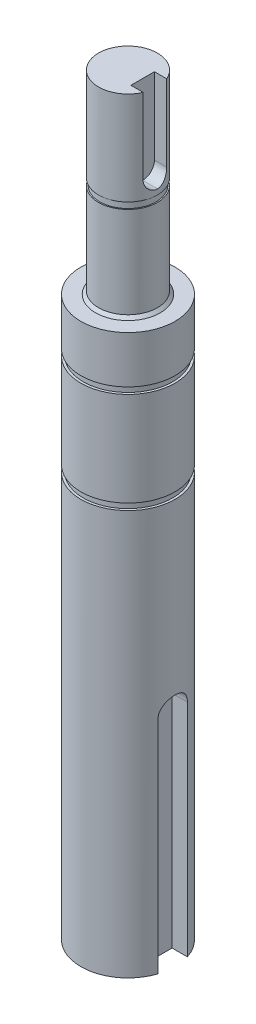
ISO-10303-21;
HEADER;
FILE_DESCRIPTION(('STEP AP214'),'2;1');
FILE_NAME('part.step','',(''),(''),'','','');
FILE_SCHEMA(('AUTOMOTIVE_DESIGN { 1 0 10303 214 1 1 1 1 }'));
ENDSEC;
DATA;
#1=APPLICATION_CONTEXT('core data for automotive mechanical design processes');
#2=APPLICATION_PROTOCOL_DEFINITION('international standard','automotive_design',2000,#1);
#3=PRODUCT_CONTEXT('',#1,'mechanical');
#4=PRODUCT('Part','Part','',(#3));
#5=PRODUCT_RELATED_PRODUCT_CATEGORY('part','',(#4));
#6=PRODUCT_DEFINITION_FORMATION('','',#4);
#7=PRODUCT_DEFINITION_CONTEXT('part definition',#1,'design');
#8=PRODUCT_DEFINITION('design','',#6,#7);
#9=PRODUCT_DEFINITION_SHAPE('','',#8);
#10=(LENGTH_UNIT() NAMED_UNIT(*) SI_UNIT(.MILLI.,.METRE.));
#11=(NAMED_UNIT(*) PLANE_ANGLE_UNIT() SI_UNIT($,.RADIAN.));
#12=(NAMED_UNIT(*) SI_UNIT($,.STERADIAN.) SOLID_ANGLE_UNIT());
#13=UNCERTAINTY_MEASURE_WITH_UNIT(LENGTH_MEASURE(1.E-05),#10,'distance_accuracy_value','');
#14=(GEOMETRIC_REPRESENTATION_CONTEXT(3) GLOBAL_UNCERTAINTY_ASSIGNED_CONTEXT((#13)) GLOBAL_UNIT_ASSIGNED_CONTEXT((#10,
#11,#12)) REPRESENTATION_CONTEXT('',''));
#15=CARTESIAN_POINT('',(0.,0.,0.));
#16=DIRECTION('',(0.,0.,1.));
#17=DIRECTION('',(1.,0.,0.));
#18=AXIS2_PLACEMENT_3D('',#15,#16,#17);
#19=CARTESIAN_POINT('',(0.,-95.,0.));
#20=DIRECTION('',(0.,-1.,0.));
#21=DIRECTION('',(0.,0.,-1.));
#22=AXIS2_PLACEMENT_3D('',#19,#20,#21);
#23=PLANE('',#22);
#24=CARTESIAN_POINT('',(0.,-95.,0.));
#25=DIRECTION('',(0.,-1.,0.));
#26=DIRECTION('',(0.,0.,-1.));
#27=AXIS2_PLACEMENT_3D('',#24,#25,#26);
#28=CIRCLE('',#27,2.1);
#29=CARTESIAN_POINT('',(0.,-95.,-2.1));
#30=VERTEX_POINT('',#29);
#31=EDGE_CURVE('E362',#30,#30,#28,.T.);
#32=ORIENTED_EDGE('',*,*,#31,.F.);
#33=EDGE_LOOP('',(#32));
#34=FACE_BOUND('',#33,.T.);
#35=CARTESIAN_POINT('',(0.,-95.,0.));
#36=DIRECTION('',(0.,-1.,0.));
#37=DIRECTION('',(0.,0.,-1.));
#38=AXIS2_PLACEMENT_3D('',#35,#36,#37);
#39=CIRCLE('',#38,8.);
#40=CARTESIAN_POINT('',(7.59934207678533,-95.,2.5));
#41=VERTEX_POINT('',#40);
#42=CARTESIAN_POINT('',(7.59934207678533,-95.,-2.5));
#43=VERTEX_POINT('',#42);
#44=EDGE_CURVE('E141',#41,#43,#39,.T.);
#45=ORIENTED_EDGE('',*,*,#44,.T.);
#46=DIRECTION('',(1.,0.,0.));
#47=VECTOR('',#46,1.);
#48=CARTESIAN_POINT('',(5.,-95.,-2.5));
#49=LINE('',#48,#47);
#50=CARTESIAN_POINT('',(5.,-95.,-2.5));
#51=VERTEX_POINT('',#50);
#52=EDGE_CURVE('E324',#51,#43,#49,.T.);
#53=ORIENTED_EDGE('',*,*,#52,.F.);
#54=DIRECTION('',(0.,0.,-1.));
#55=VECTOR('',#54,1.);
#56=CARTESIAN_POINT('',(5.,-95.,2.5));
#57=LINE('',#56,#55);
#58=CARTESIAN_POINT('',(5.,-95.,2.5));
#59=VERTEX_POINT('',#58);
#60=EDGE_CURVE('E347',#59,#51,#57,.T.);
#61=ORIENTED_EDGE('',*,*,#60,.F.);
#62=DIRECTION('',(-1.,0.,0.));
#63=VECTOR('',#62,1.);
#64=CARTESIAN_POINT('',(7.59934207678533,-95.,2.5));
#65=LINE('',#64,#63);
#66=EDGE_CURVE('E343',#41,#59,#65,.T.);
#67=ORIENTED_EDGE('',*,*,#66,.F.);
#68=EDGE_LOOP('',(#45,#53,#61,#67));
#69=FACE_BOUND('',#68,.T.);
#70=ADVANCED_FACE('F38',(#34,#69),#23,.T.);
#71=CARTESIAN_POINT('',(0.,-95.,0.));
#72=DIRECTION('',(0.,1.,0.));
#73=DIRECTION('',(0.,0.,1.));
#74=AXIS2_PLACEMENT_3D('',#71,#72,#73);
#75=CYLINDRICAL_SURFACE('',#74,8.);
#76=CARTESIAN_POINT('',(0.,-26.2,0.));
#77=DIRECTION('',(0.,1.,0.));
#78=DIRECTION('',(0.,0.,1.));
#79=AXIS2_PLACEMENT_3D('',#76,#77,#78);
#80=CIRCLE('',#79,8.);
#81=CARTESIAN_POINT('',(0.,-26.2,8.));
#82=VERTEX_POINT('',#81);
#83=EDGE_CURVE('E161',#82,#82,#80,.T.);
#84=ORIENTED_EDGE('',*,*,#83,.F.);
#85=EDGE_LOOP('',(#84));
#86=FACE_BOUND('',#85,.T.);
#87=DIRECTION('',(0.,1.,0.));
#88=VECTOR('',#87,1.);
#89=CARTESIAN_POINT('',(7.59934207678533,-376.230768092719,-2.5));
#90=LINE('',#89,#88);
#91=CARTESIAN_POINT('',(7.59934207678533,-57.5,-2.5));
#92=VERTEX_POINT('',#91);
#93=EDGE_CURVE('E320',#43,#92,#90,.T.);
#94=ORIENTED_EDGE('',*,*,#93,.F.);
#95=ORIENTED_EDGE('',*,*,#44,.F.);
#96=DIRECTION('',(0.,1.,0.));
#97=VECTOR('',#96,1.);
#98=CARTESIAN_POINT('',(7.59934207678533,-376.230768092719,2.5));
#99=LINE('',#98,#97);
#100=CARTESIAN_POINT('',(7.59934207678533,-57.5,2.5));
#101=VERTEX_POINT('',#100);
#102=EDGE_CURVE('E353',#41,#101,#99,.T.);
#103=ORIENTED_EDGE('',*,*,#102,.T.);
#104=CARTESIAN_POINT('',(7.59934207678533,-57.5,2.5));
#105=CARTESIAN_POINT('',(7.59933203059267,-57.431531563478,2.50000872196325));
#106=CARTESIAN_POINT('',(7.60026717306941,-57.3630688262051,2.49718741918658));
#107=CARTESIAN_POINT('',(7.60395313145729,-57.2266689831246,2.48595264914487));
#108=CARTESIAN_POINT('',(7.60670350954134,-57.1587317545633,2.47754053035741));
#109=CARTESIAN_POINT('',(7.61393533486615,-57.024049291047,2.45522271247334));
#110=CARTESIAN_POINT('',(7.61841199615304,-56.9573012896764,2.44133219929441));
#111=CARTESIAN_POINT('',(7.62895090994293,-56.8252934420751,2.40819606778692));
#112=CARTESIAN_POINT('',(7.63501320947711,-56.7600336400481,2.38895029061629));
#113=CARTESIAN_POINT('',(7.65531347588401,-56.5672144256323,2.32342257733534));
#114=CARTESIAN_POINT('',(7.6716751548635,-56.442436228289,2.26932026330938));
#115=CARTESIAN_POINT('',(7.70820123348356,-56.2037163263157,2.1419609847559));
#116=CARTESIAN_POINT('',(7.72836773665081,-56.089780668738,2.06869341586784));
#117=CARTESIAN_POINT('',(7.77100171280289,-55.872051458723,1.90239618040339));
#118=CARTESIAN_POINT('',(7.79352105652789,-55.768680507325,1.80882544662834));
#119=CARTESIAN_POINT('',(7.83788376428168,-55.578811225447,1.60572918907888));
#120=CARTESIAN_POINT('',(7.85972699416612,-55.4923162254135,1.49620052346257));
#121=CARTESIAN_POINT('',(7.90087771567734,-55.3367529003338,1.2612159659295));
#122=CARTESIAN_POINT('',(7.9201155937937,-55.2681295511064,1.13545249996471));
#123=CARTESIAN_POINT('',(7.95326113327994,-55.153214675019,0.873505280661303));
#124=CARTESIAN_POINT('',(7.96717355482022,-55.1069031950257,0.737330964343791));
#125=CARTESIAN_POINT('',(7.98493255267701,-55.0485350656773,0.500432439140228));
#126=CARTESIAN_POINT('',(7.99054579169218,-55.0303736604662,0.401302860064734));
#127=CARTESIAN_POINT('',(7.99809598427656,-55.0060927316699,0.201469160042704));
#128=CARTESIAN_POINT('',(8.00003381815027,-54.9999703245845,0.100765421953975));
#129=CARTESIAN_POINT('',(8.,-55.,0.));
#130=B_SPLINE_CURVE_WITH_KNOTS('',3,(#104,#105,#106,#107,#108,#109,#110,#111,#112,#113,#114,
#115,#116,#117,#118,#119,#120,#121,#122,#123,#124,#125,#126,#127,#128,#129),.UNSPECIFIED.,.F.,
.F.,(4,2,2,2,2,2,2,2,2,2,2,2,4),(0.,0.205331144838566,0.410612782770134,0.615329342028563,
0.820051974016308,1.22895878902158,1.63809233732391,2.05987818424721,2.48174718603714,
2.91328775873344,3.34444169220914,3.64649245014737,3.9484708540928),.UNSPECIFIED.);
#131=CARTESIAN_POINT('',(8.,-55.,0.));
#132=VERTEX_POINT('',#131);
#133=EDGE_CURVE('E53',#101,#132,#130,.T.);
#134=ORIENTED_EDGE('',*,*,#133,.T.);
#135=CARTESIAN_POINT('',(8.,-55.,0.));
#136=CARTESIAN_POINT('',(8.00000828681473,-54.9999914719353,-0.0685510812857066));
#137=CARTESIAN_POINT('',(7.99911908384291,-55.0028193935781,-0.137096932347897));
#138=CARTESIAN_POINT('',(7.99560730845536,-55.0140819364758,-0.273667781807106));
#139=CARTESIAN_POINT('',(7.99298509992923,-55.0225153807075,-0.341692886515693));
#140=CARTESIAN_POINT('',(7.98607774492626,-55.0448940849037,-0.47656786057859));
#141=CARTESIAN_POINT('',(7.98179688080588,-55.0588251526738,-0.543420296695729));
#142=CARTESIAN_POINT('',(7.97169475767791,-55.0920619945523,-0.675638578563826));
#143=CARTESIAN_POINT('',(7.96587346483636,-55.1113678867138,-0.74100439162836));
#144=CARTESIAN_POINT('',(7.94632126100608,-55.1771134947712,-0.934157547532818));
#145=CARTESIAN_POINT('',(7.93049329476608,-55.2314079769332,-1.05916058434143));
#146=CARTESIAN_POINT('',(7.8948846514132,-55.3592171103471,-1.29825599242918));
#147=CARTESIAN_POINT('',(7.87510214473647,-55.4327406627801,-1.41234327728855));
#148=CARTESIAN_POINT('',(7.83300545963648,-55.5993066189066,-1.62991978046949));
#149=CARTESIAN_POINT('',(7.81063643603881,-55.6928321712304,-1.73302910878894));
#150=CARTESIAN_POINT('',(7.76620277923699,-55.8957282674203,-1.92238880488912));
#151=CARTESIAN_POINT('',(7.74413823142255,-56.0051031611218,-2.00863452915542));
#152=CARTESIAN_POINT('',(7.70221548358862,-56.2399285656202,-2.16391406909981));
#153=CARTESIAN_POINT('',(7.6824263651065,-56.3657130318976,-2.23246282184784));
#154=CARTESIAN_POINT('',(7.64814458850236,-56.6276963572921,-2.34723085680233));
#155=CARTESIAN_POINT('',(7.63364673208388,-56.7638848352136,-2.39347206906809));
#156=CARTESIAN_POINT('',(7.61511563183546,-57.0005957885824,-2.45166474109376));
#157=CARTESIAN_POINT('',(7.60924580759559,-57.0995081788591,-2.46974885377124));
#158=CARTESIAN_POINT('',(7.60133872885989,-57.2989256046477,-2.49393103929294));
#159=CARTESIAN_POINT('',(7.59930112965725,-57.3994304960948,-2.50003019018091));
#160=CARTESIAN_POINT('',(7.59934207678533,-57.5,-2.5));
#161=B_SPLINE_CURVE_WITH_KNOTS('',3,(#135,#136,#137,#138,#139,#140,#141,#142,#143,#144,#145,
#146,#147,#148,#149,#150,#151,#152,#153,#154,#155,#156,#157,#158,#159,#160),.UNSPECIFIED.,.F.,
.F.,(4,2,2,2,2,2,2,2,2,2,2,2,4),(0.,0.205580238093103,0.411117322977397,0.616127245880894,
0.821141671994198,1.23068931459296,1.64042687432448,2.0614847377048,2.48265837961757,
2.91437821992857,3.34567277654391,3.64708494372789,3.94846999773575),.UNSPECIFIED.);
#162=EDGE_CURVE('E57',#132,#92,#161,.T.);
#163=ORIENTED_EDGE('',*,*,#162,.T.);
#164=EDGE_LOOP('',(#94,#95,#103,#134,#163));
#165=FACE_BOUND('',#164,.T.);
#166=ADVANCED_FACE('F233',(#86,#165),#75,.T.);
#167=CARTESIAN_POINT('',(0.,33.,0.));
#168=DIRECTION('',(0.,-1.,0.));
#169=DIRECTION('',(0.,0.,-1.));
#170=AXIS2_PLACEMENT_3D('',#167,#168,#169);
#171=CYLINDRICAL_SURFACE('',#170,5.);
#172=CARTESIAN_POINT('',(0.,0.500000000000035,0.));
#173=DIRECTION('',(0.,-1.,0.));
#174=DIRECTION('',(0.,0.,-1.));
#175=AXIS2_PLACEMENT_3D('',#172,#173,#174);
#176=CIRCLE('',#175,5.);
#177=CARTESIAN_POINT('',(0.,0.500000000000035,-5.));
#178=VERTEX_POINT('',#177);
#179=EDGE_CURVE('E46',#178,#178,#176,.F.);
#180=ORIENTED_EDGE('',*,*,#179,.T.);
#181=EDGE_LOOP('',(#180));
#182=FACE_BOUND('',#181,.T.);
#183=CARTESIAN_POINT('',(0.,16.,0.));
#184=DIRECTION('',(0.,1.,0.));
#185=DIRECTION('',(0.,0.,1.));
#186=AXIS2_PLACEMENT_3D('',#183,#184,#185);
#187=CIRCLE('',#186,5.);
#188=CARTESIAN_POINT('',(0.,16.,5.));
#189=VERTEX_POINT('',#188);
#190=EDGE_CURVE('E166',#189,#189,#187,.T.);
#191=ORIENTED_EDGE('',*,*,#190,.F.);
#192=EDGE_LOOP('',(#191));
#193=FACE_BOUND('',#192,.T.);
#194=ADVANCED_FACE('F231',(#182,#193),#171,.T.);
#195=CARTESIAN_POINT('',(0.,-8.00000000000001,0.));
#196=DIRECTION('',(0.,1.,0.));
#197=DIRECTION('',(0.,0.,1.));
#198=AXIS2_PLACEMENT_3D('',#195,#196,#197);
#199=CIRCLE('',#198,8.);
#200=CARTESIAN_POINT('',(0.,-8.00000000000001,8.));
#201=VERTEX_POINT('',#200);
#202=EDGE_CURVE('E151',#201,#201,#199,.T.);
#203=ORIENTED_EDGE('',*,*,#202,.T.);
#204=EDGE_LOOP('',(#203));
#205=FACE_BOUND('',#204,.T.);
#206=CARTESIAN_POINT('',(0.,0.,0.));
#207=DIRECTION('',(0.,-1.,0.));
#208=DIRECTION('',(0.,0.,-1.));
#209=AXIS2_PLACEMENT_3D('',#206,#207,#208);
#210=CIRCLE('',#209,8.);
#211=CARTESIAN_POINT('',(0.,0.,-8.));
#212=VERTEX_POINT('',#211);
#213=EDGE_CURVE('E147',#212,#212,#210,.T.);
#214=ORIENTED_EDGE('',*,*,#213,.T.);
#215=EDGE_LOOP('',(#214));
#216=FACE_BOUND('',#215,.T.);
#217=ADVANCED_FACE('F226',(#205,#216),#75,.T.);
#218=CARTESIAN_POINT('',(0.,0.,0.));
#219=DIRECTION('',(0.,-1.,0.));
#220=DIRECTION('',(0.,0.,-1.));
#221=AXIS2_PLACEMENT_3D('',#218,#219,#220);
#222=PLANE('',#221);
#223=CARTESIAN_POINT('',(0.,0.,0.));
#224=DIRECTION('',(0.,-1.,0.));
#225=DIRECTION('',(0.,0.,-1.));
#226=AXIS2_PLACEMENT_3D('',#223,#224,#225);
#227=CIRCLE('',#226,5.50000000000003);
#228=CARTESIAN_POINT('',(0.,0.,-5.50000000000003));
#229=VERTEX_POINT('',#228);
#230=EDGE_CURVE('E12',#229,#229,#227,.T.);
#231=ORIENTED_EDGE('',*,*,#230,.T.);
#232=EDGE_LOOP('',(#231));
#233=FACE_BOUND('',#232,.T.);
#234=ORIENTED_EDGE('',*,*,#213,.F.);
#235=EDGE_LOOP('',(#234));
#236=FACE_BOUND('',#235,.T.);
#237=ADVANCED_FACE('F230',(#233,#236),#222,.F.);
#238=CARTESIAN_POINT('',(0.,-9.1,0.));
#239=DIRECTION('',(0.,1.,0.));
#240=DIRECTION('',(0.,0.,1.));
#241=AXIS2_PLACEMENT_3D('',#238,#239,#240);
#242=PLANE('',#241);
#243=CARTESIAN_POINT('',(0.,-9.1,0.));
#244=DIRECTION('',(0.,1.,0.));
#245=DIRECTION('',(0.,0.,1.));
#246=AXIS2_PLACEMENT_3D('',#243,#244,#245);
#247=CIRCLE('',#246,7.6);
#248=CARTESIAN_POINT('',(0.,-9.1,7.6));
#249=VERTEX_POINT('',#248);
#250=EDGE_CURVE('E155',#249,#249,#247,.T.);
#251=ORIENTED_EDGE('',*,*,#250,.F.);
#252=EDGE_LOOP('',(#251));
#253=FACE_BOUND('',#252,.T.);
#254=CARTESIAN_POINT('',(0.,-9.1,0.));
#255=DIRECTION('',(0.,1.,0.));
#256=DIRECTION('',(0.,0.,1.));
#257=AXIS2_PLACEMENT_3D('',#254,#255,#256);
#258=CIRCLE('',#257,8.);
#259=CARTESIAN_POINT('',(0.,-9.1,8.));
#260=VERTEX_POINT('',#259);
#261=EDGE_CURVE('E154',#260,#260,#258,.T.);
#262=ORIENTED_EDGE('',*,*,#261,.T.);
#263=EDGE_LOOP('',(#262));
#264=FACE_BOUND('',#263,.T.);
#265=ADVANCED_FACE('F263',(#253,#264),#242,.T.);
#266=CARTESIAN_POINT('',(0.,-8.,0.));
#267=DIRECTION('',(0.,1.,0.));
#268=DIRECTION('',(0.,0.,1.));
#269=AXIS2_PLACEMENT_3D('',#266,#267,#268);
#270=PLANE('',#269);
#271=CARTESIAN_POINT('',(0.,-8.,0.));
#272=DIRECTION('',(0.,1.,0.));
#273=DIRECTION('',(0.,0.,1.));
#274=AXIS2_PLACEMENT_3D('',#271,#272,#273);
#275=CIRCLE('',#274,7.6);
#276=CARTESIAN_POINT('',(0.,-8.,7.6));
#277=VERTEX_POINT('',#276);
#278=EDGE_CURVE('E165',#277,#277,#275,.T.);
#279=ORIENTED_EDGE('',*,*,#278,.T.);
#280=EDGE_LOOP('',(#279));
#281=FACE_BOUND('',#280,.T.);
#282=ORIENTED_EDGE('',*,*,#202,.F.);
#283=EDGE_LOOP('',(#282));
#284=FACE_BOUND('',#283,.T.);
#285=ADVANCED_FACE('F259',(#281,#284),#270,.F.);
#286=CARTESIAN_POINT('',(0.,-9.1,0.));
#287=DIRECTION('',(0.,1.,0.));
#288=DIRECTION('',(0.,0.,1.));
#289=AXIS2_PLACEMENT_3D('',#286,#287,#288);
#290=CYLINDRICAL_SURFACE('',#289,7.6);
#291=ORIENTED_EDGE('',*,*,#250,.T.);
#292=EDGE_LOOP('',(#291));
#293=FACE_BOUND('',#292,.T.);
#294=ORIENTED_EDGE('',*,*,#278,.F.);
#295=EDGE_LOOP('',(#294));
#296=FACE_BOUND('',#295,.T.);
#297=ADVANCED_FACE('F262',(#293,#296),#290,.T.);
#298=CARTESIAN_POINT('',(0.,-25.1,0.));
#299=DIRECTION('',(0.,1.,0.));
#300=DIRECTION('',(0.,0.,1.));
#301=AXIS2_PLACEMENT_3D('',#298,#299,#300);
#302=CIRCLE('',#301,8.);
#303=CARTESIAN_POINT('',(0.,-25.1,8.));
#304=VERTEX_POINT('',#303);
#305=EDGE_CURVE('E158',#304,#304,#302,.T.);
#306=ORIENTED_EDGE('',*,*,#305,.T.);
#307=EDGE_LOOP('',(#306));
#308=FACE_BOUND('',#307,.T.);
#309=ORIENTED_EDGE('',*,*,#261,.F.);
#310=EDGE_LOOP('',(#309));
#311=FACE_BOUND('',#310,.T.);
#312=ADVANCED_FACE('F234',(#308,#311),#75,.T.);
#313=CARTESIAN_POINT('',(0.,-26.2,0.));
#314=DIRECTION('',(0.,1.,0.));
#315=DIRECTION('',(0.,0.,1.));
#316=AXIS2_PLACEMENT_3D('',#313,#314,#315);
#317=PLANE('',#316);
#318=CARTESIAN_POINT('',(0.,-26.2,0.));
#319=DIRECTION('',(0.,1.,0.));
#320=DIRECTION('',(0.,0.,1.));
#321=AXIS2_PLACEMENT_3D('',#318,#319,#320);
#322=CIRCLE('',#321,7.6);
#323=CARTESIAN_POINT('',(0.,-26.2,7.6));
#324=VERTEX_POINT('',#323);
#325=EDGE_CURVE('E162',#324,#324,#322,.T.);
#326=ORIENTED_EDGE('',*,*,#325,.F.);
#327=EDGE_LOOP('',(#326));
#328=FACE_BOUND('',#327,.T.);
#329=ORIENTED_EDGE('',*,*,#83,.T.);
#330=EDGE_LOOP('',(#329));
#331=FACE_BOUND('',#330,.T.);
#332=ADVANCED_FACE('F275',(#328,#331),#317,.T.);
#333=CARTESIAN_POINT('',(0.,-25.1,0.));
#334=DIRECTION('',(0.,1.,0.));
#335=DIRECTION('',(0.,0.,1.));
#336=AXIS2_PLACEMENT_3D('',#333,#334,#335);
#337=PLANE('',#336);
#338=CARTESIAN_POINT('',(0.,-25.1,0.));
#339=DIRECTION('',(0.,1.,0.));
#340=DIRECTION('',(0.,0.,1.));
#341=AXIS2_PLACEMENT_3D('',#338,#339,#340);
#342=CIRCLE('',#341,7.6);
#343=CARTESIAN_POINT('',(0.,-25.1,7.6));
#344=VERTEX_POINT('',#343);
#345=EDGE_CURVE('E172',#344,#344,#342,.T.);
#346=ORIENTED_EDGE('',*,*,#345,.T.);
#347=EDGE_LOOP('',(#346));
#348=FACE_BOUND('',#347,.T.);
#349=ORIENTED_EDGE('',*,*,#305,.F.);
#350=EDGE_LOOP('',(#349));
#351=FACE_BOUND('',#350,.T.);
#352=ADVANCED_FACE('F271',(#348,#351),#337,.F.);
#353=CARTESIAN_POINT('',(0.,-26.2,0.));
#354=DIRECTION('',(0.,1.,0.));
#355=DIRECTION('',(0.,0.,1.));
#356=AXIS2_PLACEMENT_3D('',#353,#354,#355);
#357=CYLINDRICAL_SURFACE('',#356,7.6);
#358=ORIENTED_EDGE('',*,*,#325,.T.);
#359=EDGE_LOOP('',(#358));
#360=FACE_BOUND('',#359,.T.);
#361=ORIENTED_EDGE('',*,*,#345,.F.);
#362=EDGE_LOOP('',(#361));
#363=FACE_BOUND('',#362,.T.);
#364=ADVANCED_FACE('F274',(#360,#363),#357,.T.);
#365=CARTESIAN_POINT('',(0.,17.1,0.));
#366=DIRECTION('',(0.,1.,0.));
#367=DIRECTION('',(0.,0.,1.));
#368=AXIS2_PLACEMENT_3D('',#365,#366,#367);
#369=PLANE('',#368);
#370=CARTESIAN_POINT('',(0.,17.1,0.));
#371=DIRECTION('',(0.,1.,0.));
#372=DIRECTION('',(0.,0.,1.));
#373=AXIS2_PLACEMENT_3D('',#370,#371,#372);
#374=CIRCLE('',#373,4.8);
#375=CARTESIAN_POINT('',(0.,17.1,4.8));
#376=VERTEX_POINT('',#375);
#377=EDGE_CURVE('E170',#376,#376,#374,.T.);
#378=ORIENTED_EDGE('',*,*,#377,.T.);
#379=EDGE_LOOP('',(#378));
#380=FACE_BOUND('',#379,.T.);
#381=CARTESIAN_POINT('',(0.,17.1,0.));
#382=DIRECTION('',(0.,1.,0.));
#383=DIRECTION('',(0.,0.,1.));
#384=AXIS2_PLACEMENT_3D('',#381,#382,#383);
#385=CIRCLE('',#384,5.);
#386=CARTESIAN_POINT('',(0.,17.1,5.));
#387=VERTEX_POINT('',#386);
#388=EDGE_CURVE('E169',#387,#387,#385,.T.);
#389=ORIENTED_EDGE('',*,*,#388,.F.);
#390=EDGE_LOOP('',(#389));
#391=FACE_BOUND('',#390,.T.);
#392=ADVANCED_FACE('F282',(#380,#391),#369,.F.);
#393=CARTESIAN_POINT('',(0.,16.,0.));
#394=DIRECTION('',(0.,1.,0.));
#395=DIRECTION('',(0.,0.,1.));
#396=AXIS2_PLACEMENT_3D('',#393,#394,#395);
#397=PLANE('',#396);
#398=CARTESIAN_POINT('',(0.,16.,0.));
#399=DIRECTION('',(0.,1.,0.));
#400=DIRECTION('',(0.,0.,1.));
#401=AXIS2_PLACEMENT_3D('',#398,#399,#400);
#402=CIRCLE('',#401,4.8);
#403=CARTESIAN_POINT('',(0.,16.,4.8));
#404=VERTEX_POINT('',#403);
#405=EDGE_CURVE('E369',#404,#404,#402,.T.);
#406=ORIENTED_EDGE('',*,*,#405,.F.);
#407=EDGE_LOOP('',(#406));
#408=FACE_BOUND('',#407,.T.);
#409=ORIENTED_EDGE('',*,*,#190,.T.);
#410=EDGE_LOOP('',(#409));
#411=FACE_BOUND('',#410,.T.);
#412=ADVANCED_FACE('F246',(#408,#411),#397,.T.);
#413=CARTESIAN_POINT('',(0.,17.1,0.));
#414=DIRECTION('',(0.,-1.,0.));
#415=DIRECTION('',(0.,0.,-1.));
#416=AXIS2_PLACEMENT_3D('',#413,#414,#415);
#417=CYLINDRICAL_SURFACE('',#416,4.8);
#418=ORIENTED_EDGE('',*,*,#377,.F.);
#419=EDGE_LOOP('',(#418));
#420=FACE_BOUND('',#419,.T.);
#421=ORIENTED_EDGE('',*,*,#405,.T.);
#422=EDGE_LOOP('',(#421));
#423=FACE_BOUND('',#422,.T.);
#424=ADVANCED_FACE('F238',(#420,#423),#417,.T.);
#425=CARTESIAN_POINT('',(0.,33.,0.));
#426=DIRECTION('',(0.,1.,0.));
#427=DIRECTION('',(0.,0.,1.));
#428=AXIS2_PLACEMENT_3D('',#425,#426,#427);
#429=PLANE('',#428);
#430=DIRECTION('',(1.,0.,0.));
#431=VECTOR('',#430,1.);
#432=CARTESIAN_POINT('',(2.5,33.,2.));
#433=LINE('',#432,#431);
#434=CARTESIAN_POINT('',(2.5,33.,2.));
#435=VERTEX_POINT('',#434);
#436=CARTESIAN_POINT('',(4.58257569495584,33.,2.));
#437=VERTEX_POINT('',#436);
#438=EDGE_CURVE('E125',#435,#437,#433,.T.);
#439=ORIENTED_EDGE('',*,*,#438,.F.);
#440=DIRECTION('',(0.,0.,1.));
#441=VECTOR('',#440,1.);
#442=CARTESIAN_POINT('',(2.5,33.,-2.));
#443=LINE('',#442,#441);
#444=CARTESIAN_POINT('',(2.5,33.,-2.));
#445=VERTEX_POINT('',#444);
#446=EDGE_CURVE('E133',#445,#435,#443,.T.);
#447=ORIENTED_EDGE('',*,*,#446,.F.);
#448=DIRECTION('',(-1.,0.,0.));
#449=VECTOR('',#448,1.);
#450=CARTESIAN_POINT('',(4.58257569495584,33.,-2.));
#451=LINE('',#450,#449);
#452=CARTESIAN_POINT('',(4.58257569495584,33.,-2.));
#453=VERTEX_POINT('',#452);
#454=EDGE_CURVE('E117',#453,#445,#451,.T.);
#455=ORIENTED_EDGE('',*,*,#454,.F.);
#456=CARTESIAN_POINT('',(0.,33.,0.));
#457=DIRECTION('',(0.,1.,0.));
#458=DIRECTION('',(0.,0.,1.));
#459=AXIS2_PLACEMENT_3D('',#456,#457,#458);
#460=CIRCLE('',#459,5.);
#461=EDGE_CURVE('E131',#453,#437,#460,.T.);
#462=ORIENTED_EDGE('',*,*,#461,.T.);
#463=EDGE_LOOP('',(#439,#447,#455,#462));
#464=FACE_BOUND('',#463,.T.);
#465=ADVANCED_FACE('F130',(#464),#429,.T.);
#466=ORIENTED_EDGE('',*,*,#388,.T.);
#467=EDGE_LOOP('',(#466));
#468=FACE_BOUND('',#467,.T.);
#469=DIRECTION('',(0.,1.,0.));
#470=VECTOR('',#469,1.);
#471=CARTESIAN_POINT('',(4.58257569495584,18.,-2.));
#472=LINE('',#471,#470);
#473=CARTESIAN_POINT('',(4.58257569495584,20.,-2.));
#474=VERTEX_POINT('',#473);
#475=EDGE_CURVE('E113',#474,#453,#472,.T.);
#476=ORIENTED_EDGE('',*,*,#475,.F.);
#477=CARTESIAN_POINT('',(4.58257569495584,20.,-2.));
#478=CARTESIAN_POINT('',(4.58256464275298,19.9461920532779,-2.00000798226547));
#479=CARTESIAN_POINT('',(4.58352313442188,19.8923901448726,-1.99782874490323));
#480=CARTESIAN_POINT('',(4.5872966203973,19.7852203783282,-1.98915821670635));
#481=CARTESIAN_POINT('',(4.5901109073494,19.7318523626497,-1.98266856881979));
#482=CARTESIAN_POINT('',(4.59749868539403,19.6261429455243,-1.96547403396094));
#483=CARTESIAN_POINT('',(4.60206508273537,19.5737982875041,-1.95478614029394));
#484=CARTESIAN_POINT('',(4.61280101528185,19.4702952308416,-1.92931514556297));
#485=CARTESIAN_POINT('',(4.6189706482353,19.4191369047367,-1.91453179479781));
#486=CARTESIAN_POINT('',(4.63959263808194,19.2680661518476,-1.86427039137914));
#487=CARTESIAN_POINT('',(4.65617382537423,19.1703496656957,-1.82284658382869));
#488=CARTESIAN_POINT('',(4.69312290325746,18.9832079687163,-1.72548410131523));
#489=CARTESIAN_POINT('',(4.71349453753741,18.8937910871224,-1.66953105454033));
#490=CARTESIAN_POINT('',(4.75700971229099,18.7207386764433,-1.5413192827261));
#491=CARTESIAN_POINT('',(4.78024183177243,18.6376348738544,-1.46837145068181));
#492=CARTESIAN_POINT('',(4.82612745066481,18.4844612368641,-1.30969788005014));
#493=CARTESIAN_POINT('',(4.84878081667053,18.4143943845648,-1.22396922600595));
#494=CARTESIAN_POINT('',(4.89204182066139,18.2865706438305,-1.03797402696559));
#495=CARTESIAN_POINT('',(4.91253186687148,18.2294160187119,-0.937264095137757));
#496=CARTESIAN_POINT('',(4.94805155705439,18.1331253288943,-0.726735487214705));
#497=CARTESIAN_POINT('',(4.96308739385851,18.0939688151521,-0.616927316658774));
#498=CARTESIAN_POINT('',(4.98281366909797,18.0432607730851,-0.422308681432876));
#499=CARTESIAN_POINT('',(4.98920714607479,18.0270932717994,-0.338847141215359));
#500=CARTESIAN_POINT('',(4.9978239365109,18.0054403170328,-0.17027989355554));
#501=CARTESIAN_POINT('',(5.00004414047217,17.9999628285444,-0.0851730078309222));
#502=CARTESIAN_POINT('',(5.,18.,0.));
#503=B_SPLINE_CURVE_WITH_KNOTS('',3,(#477,#478,#479,#480,#481,#482,#483,#484,#485,#486,#487,
#488,#489,#490,#491,#492,#493,#494,#495,#496,#497,#498,#499,#500,#501,#502),.UNSPECIFIED.,.F.,
.F.,(4,2,2,2,2,2,2,2,2,2,2,2,4),(0.,0.161361132218348,0.322660795595026,0.483314182470729,
0.643977366585654,0.964676637786453,1.28569434990803,1.62317652692534,1.96073580574917,
2.31175518758891,2.6623747573584,2.91738155220578,3.17257827694264),.UNSPECIFIED.);
#504=CARTESIAN_POINT('',(5.,18.,0.));
#505=VERTEX_POINT('',#504);
#506=EDGE_CURVE('E186',#474,#505,#503,.T.);
#507=ORIENTED_EDGE('',*,*,#506,.T.);
#508=CARTESIAN_POINT('',(5.,18.,0.));
#509=CARTESIAN_POINT('',(5.00000805896568,17.9999924221171,0.0539825664563224));
#510=CARTESIAN_POINT('',(4.99912596417449,18.0021854094433,0.107960110320675));
#511=CARTESIAN_POINT('',(4.9956416195171,18.0109136582425,0.21549152569299));
#512=CARTESIAN_POINT('',(4.99303987942887,18.0174476328601,0.269045518000413));
#513=CARTESIAN_POINT('',(4.98618834146238,18.0347686998799,0.375162640014687));
#514=CARTESIAN_POINT('',(4.98194434350163,18.0455408267315,0.427728581646533));
#515=CARTESIAN_POINT('',(4.97192620219358,18.07122098327,0.531678089194857));
#516=CARTESIAN_POINT('',(4.96615199758777,18.0861291785368,0.583061607686044));
#517=CARTESIAN_POINT('',(4.94675280678146,18.1368426597243,0.734842037962945));
#518=CARTESIAN_POINT('',(4.93103965584297,18.1786647829143,0.833037602437027));
#519=CARTESIAN_POINT('',(4.89558681296197,18.276961119535,1.02098836831291));
#520=CARTESIAN_POINT('',(4.87584411112943,18.3334462942184,1.11073718673261));
#521=CARTESIAN_POINT('',(4.83330860764966,18.4622358936902,1.2834989710368));
#522=CARTESIAN_POINT('',(4.81042198821339,18.5351093972576,1.36606513383557));
#523=CARTESIAN_POINT('',(4.76460445713637,18.6934051845059,1.51817975582642));
#524=CARTESIAN_POINT('',(4.74167353049049,18.7788329484105,1.58772249969095));
#525=CARTESIAN_POINT('',(4.69721798262516,18.9644686863844,1.71490322313788));
#526=CARTESIAN_POINT('',(4.67580310017044,19.0651688193418,1.77186456014057));
#527=CARTESIAN_POINT('',(4.63832030094516,19.2756461845865,1.86779273517168));
#528=CARTESIAN_POINT('',(4.6222450235333,19.3854106586983,1.90678437340489));
#529=CARTESIAN_POINT('',(4.60110694265762,19.5796038437704,1.95713070702437));
#530=CARTESIAN_POINT('',(4.59422849336489,19.6626513431224,1.97314512573215));
#531=CARTESIAN_POINT('',(4.58493031504587,19.8304396216755,1.99460528633617));
#532=CARTESIAN_POINT('',(4.58251586581701,19.915182286299,2.00003851372961));
#533=CARTESIAN_POINT('',(4.58257569495584,20.,2.));
#534=B_SPLINE_CURVE_WITH_KNOTS('',3,(#508,#509,#510,#511,#512,#513,#514,#515,#516,#517,#518,
#519,#520,#521,#522,#523,#524,#525,#526,#527,#528,#529,#530,#531,#532,#533),.UNSPECIFIED.,.F.,
.F.,(4,2,2,2,2,2,2,2,2,2,2,2,4),(0.,0.161887516282227,0.323727063545162,0.485000187552342,
0.646279768757659,0.968331009877645,1.2906236947287,1.626578356582,1.96268010840895,
2.31390836587329,2.66465042644721,2.91846381435153,3.17257720854796),.UNSPECIFIED.);
#535=CARTESIAN_POINT('',(4.58257569495584,20.,2.));
#536=VERTEX_POINT('',#535);
#537=EDGE_CURVE('E178',#505,#536,#534,.T.);
#538=ORIENTED_EDGE('',*,*,#537,.T.);
#539=DIRECTION('',(0.,1.,0.));
#540=VECTOR('',#539,1.);
#541=CARTESIAN_POINT('',(4.58257569495584,18.,2.));
#542=LINE('',#541,#540);
#543=EDGE_CURVE('E138',#536,#437,#542,.T.);
#544=ORIENTED_EDGE('',*,*,#543,.T.);
#545=ORIENTED_EDGE('',*,*,#461,.F.);
#546=EDGE_LOOP('',(#476,#507,#538,#544,#545));
#547=FACE_BOUND('',#546,.T.);
#548=ADVANCED_FACE('F136',(#468,#547),#171,.T.);
#549=CARTESIAN_POINT('',(0.,-85.,0.));
#550=DIRECTION('',(0.,-1.,0.));
#551=DIRECTION('',(0.,0.,-1.));
#552=AXIS2_PLACEMENT_3D('',#549,#550,#551);
#553=CYLINDRICAL_SURFACE('',#552,2.1);
#554=CARTESIAN_POINT('',(0.,-85.,0.));
#555=DIRECTION('',(0.,-1.,0.));
#556=DIRECTION('',(0.,0.,-1.));
#557=AXIS2_PLACEMENT_3D('',#554,#555,#556);
#558=CIRCLE('',#557,2.1);
#559=CARTESIAN_POINT('',(0.,-85.,-2.1));
#560=VERTEX_POINT('',#559);
#561=EDGE_CURVE('E366',#560,#560,#558,.T.);
#562=ORIENTED_EDGE('',*,*,#561,.F.);
#563=EDGE_LOOP('',(#562));
#564=FACE_BOUND('',#563,.T.);
#565=ORIENTED_EDGE('',*,*,#31,.T.);
#566=EDGE_LOOP('',(#565));
#567=FACE_BOUND('',#566,.T.);
#568=ADVANCED_FACE('F243',(#564,#567),#553,.F.);
#569=CARTESIAN_POINT('',(0.,-85.,0.));
#570=DIRECTION('',(0.,-1.,0.));
#571=DIRECTION('',(0.,0.,-1.));
#572=AXIS2_PLACEMENT_3D('',#569,#570,#571);
#573=PLANE('',#572);
#574=ORIENTED_EDGE('',*,*,#561,.T.);
#575=EDGE_LOOP('',(#574));
#576=FACE_BOUND('',#575,.T.);
#577=ADVANCED_FACE('F292',(#576),#573,.T.);
#578=CARTESIAN_POINT('',(2.5,18.,2.));
#579=DIRECTION('',(0.,0.,1.));
#580=DIRECTION('',(1.,0.,0.));
#581=AXIS2_PLACEMENT_3D('',#578,#579,#580);
#582=PLANE('',#581);
#583=ORIENTED_EDGE('',*,*,#543,.F.);
#584=DIRECTION('',(1.,0.,0.));
#585=VECTOR('',#584,1.);
#586=CARTESIAN_POINT('',(2.5,20.,2.));
#587=LINE('',#586,#585);
#588=CARTESIAN_POINT('',(2.5,20.,2.));
#589=VERTEX_POINT('',#588);
#590=EDGE_CURVE('E140',#536,#589,#587,.F.);
#591=ORIENTED_EDGE('',*,*,#590,.T.);
#592=DIRECTION('',(0.,1.,0.));
#593=VECTOR('',#592,1.);
#594=CARTESIAN_POINT('',(2.5,18.,2.));
#595=LINE('',#594,#593);
#596=EDGE_CURVE('E363',#589,#435,#595,.T.);
#597=ORIENTED_EDGE('',*,*,#596,.T.);
#598=ORIENTED_EDGE('',*,*,#438,.T.);
#599=EDGE_LOOP('',(#583,#591,#597,#598));
#600=FACE_BOUND('',#599,.T.);
#601=ADVANCED_FACE('F296',(#600),#582,.F.);
#602=CARTESIAN_POINT('',(2.5,18.,-2.));
#603=DIRECTION('',(-1.,0.,0.));
#604=DIRECTION('',(0.,0.,1.));
#605=AXIS2_PLACEMENT_3D('',#602,#603,#604);
#606=PLANE('',#605);
#607=ORIENTED_EDGE('',*,*,#596,.F.);
#608=CARTESIAN_POINT('',(2.5,20.,0.));
#609=DIRECTION('',(-1.,0.,0.));
#610=DIRECTION('',(0.,0.,1.));
#611=AXIS2_PLACEMENT_3D('',#608,#609,#610);
#612=CIRCLE('',#611,2.);
#613=CARTESIAN_POINT('',(2.5,18.,0.));
#614=VERTEX_POINT('',#613);
#615=EDGE_CURVE('E175',#589,#614,#612,.F.);
#616=ORIENTED_EDGE('',*,*,#615,.T.);
#617=CARTESIAN_POINT('',(2.5,20.,0.));
#618=DIRECTION('',(-1.,0.,0.));
#619=DIRECTION('',(0.,0.,1.));
#620=AXIS2_PLACEMENT_3D('',#617,#618,#619);
#621=CIRCLE('',#620,2.);
#622=CARTESIAN_POINT('',(2.5,20.,-2.));
#623=VERTEX_POINT('',#622);
#624=EDGE_CURVE('E144',#614,#623,#621,.F.);
#625=ORIENTED_EDGE('',*,*,#624,.T.);
#626=DIRECTION('',(0.,1.,0.));
#627=VECTOR('',#626,1.);
#628=CARTESIAN_POINT('',(2.5,18.,-2.));
#629=LINE('',#628,#627);
#630=EDGE_CURVE('E124',#623,#445,#629,.T.);
#631=ORIENTED_EDGE('',*,*,#630,.T.);
#632=ORIENTED_EDGE('',*,*,#446,.T.);
#633=EDGE_LOOP('',(#607,#616,#625,#631,#632));
#634=FACE_BOUND('',#633,.T.);
#635=ADVANCED_FACE('F300',(#634),#606,.F.);
#636=CARTESIAN_POINT('',(4.58257569495584,18.,-2.));
#637=DIRECTION('',(0.,0.,-1.));
#638=DIRECTION('',(-1.,0.,0.));
#639=AXIS2_PLACEMENT_3D('',#636,#637,#638);
#640=PLANE('',#639);
#641=ORIENTED_EDGE('',*,*,#630,.F.);
#642=DIRECTION('',(-1.,0.,0.));
#643=VECTOR('',#642,1.);
#644=CARTESIAN_POINT('',(4.58257569495584,20.,-2.));
#645=LINE('',#644,#643);
#646=EDGE_CURVE('E120',#623,#474,#645,.F.);
#647=ORIENTED_EDGE('',*,*,#646,.T.);
#648=ORIENTED_EDGE('',*,*,#475,.T.);
#649=ORIENTED_EDGE('',*,*,#454,.T.);
#650=EDGE_LOOP('',(#641,#647,#648,#649));
#651=FACE_BOUND('',#650,.T.);
#652=ADVANCED_FACE('F116',(#651),#640,.F.);
#653=CARTESIAN_POINT('',(0.,20.,0.));
#654=DIRECTION('',(1.,0.,0.));
#655=DIRECTION('',(0.,0.,-1.));
#656=AXIS2_PLACEMENT_3D('',#653,#654,#655);
#657=CYLINDRICAL_SURFACE('',#656,2.);
#658=ORIENTED_EDGE('',*,*,#646,.F.);
#659=ORIENTED_EDGE('',*,*,#624,.F.);
#660=DIRECTION('',(-1.,0.,0.));
#661=VECTOR('',#660,1.);
#662=CARTESIAN_POINT('',(2.5,18.,0.));
#663=LINE('',#662,#661);
#664=EDGE_CURVE('E134',#505,#614,#663,.T.);
#665=ORIENTED_EDGE('',*,*,#664,.F.);
#666=ORIENTED_EDGE('',*,*,#506,.F.);
#667=EDGE_LOOP('',(#658,#659,#665,#666));
#668=FACE_BOUND('',#667,.T.);
#669=ADVANCED_FACE('F199',(#668),#657,.F.);
#670=CARTESIAN_POINT('',(0.,20.,0.));
#671=DIRECTION('',(-1.,0.,0.));
#672=DIRECTION('',(0.,0.,1.));
#673=AXIS2_PLACEMENT_3D('',#670,#671,#672);
#674=CYLINDRICAL_SURFACE('',#673,2.);
#675=ORIENTED_EDGE('',*,*,#615,.F.);
#676=ORIENTED_EDGE('',*,*,#590,.F.);
#677=ORIENTED_EDGE('',*,*,#537,.F.);
#678=ORIENTED_EDGE('',*,*,#664,.T.);
#679=EDGE_LOOP('',(#675,#676,#677,#678));
#680=FACE_BOUND('',#679,.T.);
#681=ADVANCED_FACE('F195',(#680),#674,.F.);
#682=CARTESIAN_POINT('',(5.,-376.230768092719,-2.5));
#683=DIRECTION('',(0.,0.,1.));
#684=DIRECTION('',(1.,0.,0.));
#685=AXIS2_PLACEMENT_3D('',#682,#683,#684);
#686=PLANE('',#685);
#687=ORIENTED_EDGE('',*,*,#93,.T.);
#688=DIRECTION('',(1.,0.,0.));
#689=VECTOR('',#688,1.);
#690=CARTESIAN_POINT('',(5.,-57.5,-2.5));
#691=LINE('',#690,#689);
#692=CARTESIAN_POINT('',(5.,-57.5,-2.5));
#693=VERTEX_POINT('',#692);
#694=EDGE_CURVE('E219',#92,#693,#691,.F.);
#695=ORIENTED_EDGE('',*,*,#694,.T.);
#696=DIRECTION('',(0.,1.,0.));
#697=VECTOR('',#696,1.);
#698=CARTESIAN_POINT('',(5.,-376.230768092719,-2.5));
#699=LINE('',#698,#697);
#700=EDGE_CURVE('E326',#51,#693,#699,.T.);
#701=ORIENTED_EDGE('',*,*,#700,.F.);
#702=ORIENTED_EDGE('',*,*,#52,.T.);
#703=EDGE_LOOP('',(#687,#695,#701,#702));
#704=FACE_BOUND('',#703,.T.);
#705=ADVANCED_FACE('F198',(#704),#686,.T.);
#706=CARTESIAN_POINT('',(5.,-376.230768092719,2.5));
#707=DIRECTION('',(1.,0.,0.));
#708=DIRECTION('',(0.,0.,-1.));
#709=AXIS2_PLACEMENT_3D('',#706,#707,#708);
#710=PLANE('',#709);
#711=CARTESIAN_POINT('',(5.,-57.5,0.));
#712=DIRECTION('',(1.,0.,0.));
#713=DIRECTION('',(0.,0.,-1.));
#714=AXIS2_PLACEMENT_3D('',#711,#712,#713);
#715=CIRCLE('',#714,2.5);
#716=CARTESIAN_POINT('',(5.,-55.,0.));
#717=VERTEX_POINT('',#716);
#718=EDGE_CURVE('E333',#693,#717,#715,.T.);
#719=ORIENTED_EDGE('',*,*,#718,.T.);
#720=CARTESIAN_POINT('',(5.,-57.5,0.));
#721=DIRECTION('',(1.,0.,0.));
#722=DIRECTION('',(0.,0.,-1.));
#723=AXIS2_PLACEMENT_3D('',#720,#721,#722);
#724=CIRCLE('',#723,2.5);
#725=CARTESIAN_POINT('',(5.,-57.5,2.5));
#726=VERTEX_POINT('',#725);
#727=EDGE_CURVE('E336',#717,#726,#724,.T.);
#728=ORIENTED_EDGE('',*,*,#727,.T.);
#729=DIRECTION('',(0.,1.,0.));
#730=VECTOR('',#729,1.);
#731=CARTESIAN_POINT('',(5.,-376.230768092719,2.5));
#732=LINE('',#731,#730);
#733=EDGE_CURVE('E327',#59,#726,#732,.T.);
#734=ORIENTED_EDGE('',*,*,#733,.F.);
#735=ORIENTED_EDGE('',*,*,#60,.T.);
#736=ORIENTED_EDGE('',*,*,#700,.T.);
#737=EDGE_LOOP('',(#719,#728,#734,#735,#736));
#738=FACE_BOUND('',#737,.T.);
#739=ADVANCED_FACE('F310',(#738),#710,.T.);
#740=CARTESIAN_POINT('',(7.59934207678533,-376.230768092719,2.5));
#741=DIRECTION('',(0.,0.,-1.));
#742=DIRECTION('',(-1.,0.,0.));
#743=AXIS2_PLACEMENT_3D('',#740,#741,#742);
#744=PLANE('',#743);
#745=ORIENTED_EDGE('',*,*,#733,.T.);
#746=DIRECTION('',(-1.,0.,0.));
#747=VECTOR('',#746,1.);
#748=CARTESIAN_POINT('',(7.59934207678533,-57.5,2.5));
#749=LINE('',#748,#747);
#750=EDGE_CURVE('E334',#726,#101,#749,.F.);
#751=ORIENTED_EDGE('',*,*,#750,.T.);
#752=ORIENTED_EDGE('',*,*,#102,.F.);
#753=ORIENTED_EDGE('',*,*,#66,.T.);
#754=EDGE_LOOP('',(#745,#751,#752,#753));
#755=FACE_BOUND('',#754,.T.);
#756=ADVANCED_FACE('F307',(#755),#744,.T.);
#757=CARTESIAN_POINT('',(0.,-57.5,0.));
#758=DIRECTION('',(-1.,0.,0.));
#759=DIRECTION('',(0.,0.,1.));
#760=AXIS2_PLACEMENT_3D('',#757,#758,#759);
#761=CYLINDRICAL_SURFACE('',#760,2.5);
#762=ORIENTED_EDGE('',*,*,#694,.F.);
#763=ORIENTED_EDGE('',*,*,#162,.F.);
#764=DIRECTION('',(1.,0.,0.));
#765=VECTOR('',#764,1.);
#766=CARTESIAN_POINT('',(7.59934207678533,-55.,0.));
#767=LINE('',#766,#765);
#768=EDGE_CURVE('E355',#717,#132,#767,.T.);
#769=ORIENTED_EDGE('',*,*,#768,.F.);
#770=ORIENTED_EDGE('',*,*,#718,.F.);
#771=EDGE_LOOP('',(#762,#763,#769,#770));
#772=FACE_BOUND('',#771,.T.);
#773=ADVANCED_FACE('F208',(#772),#761,.F.);
#774=CARTESIAN_POINT('',(0.,-57.5,0.));
#775=DIRECTION('',(1.,0.,0.));
#776=DIRECTION('',(0.,0.,-1.));
#777=AXIS2_PLACEMENT_3D('',#774,#775,#776);
#778=CYLINDRICAL_SURFACE('',#777,2.5);
#779=ORIENTED_EDGE('',*,*,#133,.F.);
#780=ORIENTED_EDGE('',*,*,#750,.F.);
#781=ORIENTED_EDGE('',*,*,#727,.F.);
#782=ORIENTED_EDGE('',*,*,#768,.T.);
#783=EDGE_LOOP('',(#779,#780,#781,#782));
#784=FACE_BOUND('',#783,.T.);
#785=ADVANCED_FACE('F205',(#784),#778,.F.);
#786=CARTESIAN_POINT('',(0.,0.500000000000035,0.));
#787=DIRECTION('',(0.,-1.,0.));
#788=DIRECTION('',(0.,0.,-1.));
#789=AXIS2_PLACEMENT_3D('',#786,#787,#788);
#790=CONICAL_SURFACE('',#789,5.,0.785398163397447);
#791=ORIENTED_EDGE('',*,*,#230,.F.);
#792=EDGE_LOOP('',(#791));
#793=FACE_BOUND('',#792,.T.);
#794=ORIENTED_EDGE('',*,*,#179,.F.);
#795=EDGE_LOOP('',(#794));
#796=FACE_BOUND('',#795,.T.);
#797=ADVANCED_FACE('F40',(#793,#796),#790,.T.);
#798=CLOSED_SHELL('',(#70,#166,#194,#217,#237,#265,#285,#297,#312,#332,#352,#364,#392,#412,#424,
#465,#548,#568,#577,#601,#635,#652,#669,#681,#705,#739,#756,#773,#785,#797));
#799=MANIFOLD_SOLID_BREP('B2',#798);
#800=ADVANCED_BREP_SHAPE_REPRESENTATION('',(#18,#799),#14);
#801=SHAPE_DEFINITION_REPRESENTATION(#9,#800);
ENDSEC;
END-ISO-10303-21;
